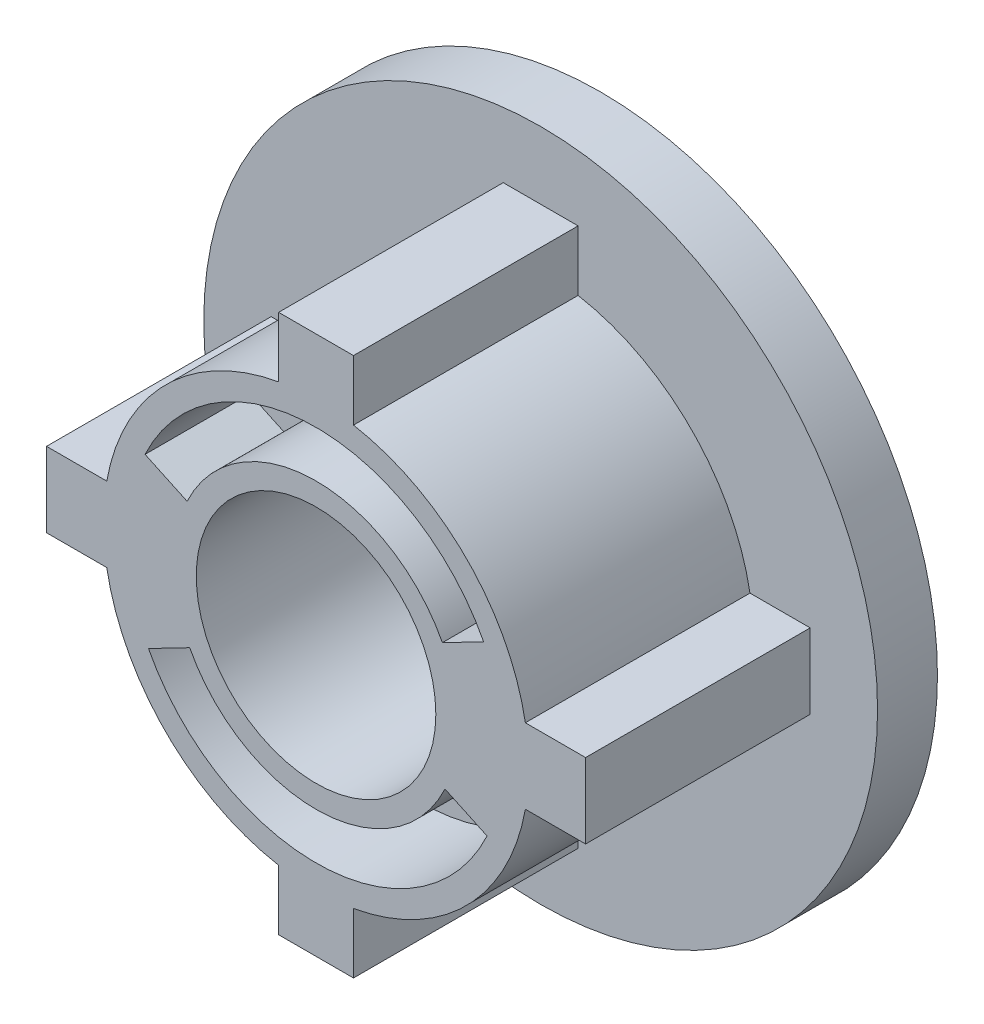
ISO-10303-21;
HEADER;
FILE_DESCRIPTION(('STEP AP214'),'2;1');
FILE_NAME('part.step','',(''),(''),'','','');
FILE_SCHEMA(('AUTOMOTIVE_DESIGN { 1 0 10303 214 1 1 1 1 }'));
ENDSEC;
DATA;
#1=APPLICATION_CONTEXT('core data for automotive mechanical design processes');
#2=APPLICATION_PROTOCOL_DEFINITION('international standard','automotive_design',2000,#1);
#3=PRODUCT_CONTEXT('',#1,'mechanical');
#4=PRODUCT('Part','Part','',(#3));
#5=PRODUCT_RELATED_PRODUCT_CATEGORY('part','',(#4));
#6=PRODUCT_DEFINITION_FORMATION('','',#4);
#7=PRODUCT_DEFINITION_CONTEXT('part definition',#1,'design');
#8=PRODUCT_DEFINITION('design','',#6,#7);
#9=PRODUCT_DEFINITION_SHAPE('','',#8);
#10=(LENGTH_UNIT() NAMED_UNIT(*) SI_UNIT(.MILLI.,.METRE.));
#11=(NAMED_UNIT(*) PLANE_ANGLE_UNIT() SI_UNIT($,.RADIAN.));
#12=(NAMED_UNIT(*) SI_UNIT($,.STERADIAN.) SOLID_ANGLE_UNIT());
#13=UNCERTAINTY_MEASURE_WITH_UNIT(LENGTH_MEASURE(1.E-05),#10,'distance_accuracy_value','');
#14=(GEOMETRIC_REPRESENTATION_CONTEXT(3) GLOBAL_UNCERTAINTY_ASSIGNED_CONTEXT((#13)) GLOBAL_UNIT_ASSIGNED_CONTEXT((#10,
#11,#12)) REPRESENTATION_CONTEXT('',''));
#15=CARTESIAN_POINT('',(0.,0.,0.));
#16=DIRECTION('',(0.,0.,1.));
#17=DIRECTION('',(1.,0.,0.));
#18=AXIS2_PLACEMENT_3D('',#15,#16,#17);
#19=CARTESIAN_POINT('',(0.,0.,0.));
#20=DIRECTION('',(0.,0.,-1.));
#21=DIRECTION('',(-1.,0.,0.));
#22=AXIS2_PLACEMENT_3D('',#19,#20,#21);
#23=PLANE('',#22);
#24=CARTESIAN_POINT('',(0.,0.,0.));
#25=DIRECTION('',(0.,0.,-1.));
#26=DIRECTION('',(-1.,0.,0.));
#27=AXIS2_PLACEMENT_3D('',#24,#25,#26);
#28=CIRCLE('',#27,22.5);
#29=CARTESIAN_POINT('',(-22.5,0.,0.));
#30=VERTEX_POINT('',#29);
#31=EDGE_CURVE('E414',#30,#30,#28,.T.);
#32=ORIENTED_EDGE('',*,*,#31,.F.);
#33=EDGE_LOOP('',(#32));
#34=FACE_BOUND('',#33,.T.);
#35=DIRECTION('',(0.,-1.,0.));
#36=VECTOR('',#35,1.);
#37=CARTESIAN_POINT('',(-2.50000000000001,0.,0.));
#38=LINE('',#37,#36);
#39=CARTESIAN_POINT('',(-2.50000000000001,18.,0.));
#40=VERTEX_POINT('',#39);
#41=CARTESIAN_POINT('',(-2.50000000000001,13.9781973086661,0.));
#42=VERTEX_POINT('',#41);
#43=EDGE_CURVE('E282',#40,#42,#38,.T.);
#44=ORIENTED_EDGE('',*,*,#43,.F.);
#45=DIRECTION('',(-1.,0.,0.));
#46=VECTOR('',#45,1.);
#47=CARTESIAN_POINT('',(0.,18.,0.));
#48=LINE('',#47,#46);
#49=CARTESIAN_POINT('',(2.5,18.,0.));
#50=VERTEX_POINT('',#49);
#51=EDGE_CURVE('E287',#50,#40,#48,.T.);
#52=ORIENTED_EDGE('',*,*,#51,.F.);
#53=DIRECTION('',(0.,1.,0.));
#54=VECTOR('',#53,1.);
#55=CARTESIAN_POINT('',(2.5,0.,0.));
#56=LINE('',#55,#54);
#57=CARTESIAN_POINT('',(2.5,13.9781973086661,0.));
#58=VERTEX_POINT('',#57);
#59=EDGE_CURVE('E359',#58,#50,#56,.T.);
#60=ORIENTED_EDGE('',*,*,#59,.F.);
#61=CARTESIAN_POINT('',(0.,0.,0.));
#62=DIRECTION('',(0.,0.,1.));
#63=DIRECTION('',(1.,0.,0.));
#64=AXIS2_PLACEMENT_3D('',#61,#62,#63);
#65=CIRCLE('',#64,14.2);
#66=CARTESIAN_POINT('',(13.9781973086661,2.5,0.));
#67=VERTEX_POINT('',#66);
#68=EDGE_CURVE('E356',#67,#58,#65,.T.);
#69=ORIENTED_EDGE('',*,*,#68,.F.);
#70=DIRECTION('',(-1.,0.,0.));
#71=VECTOR('',#70,1.);
#72=CARTESIAN_POINT('',(0.,2.5,0.));
#73=LINE('',#72,#71);
#74=CARTESIAN_POINT('',(18.,2.5,0.));
#75=VERTEX_POINT('',#74);
#76=EDGE_CURVE('E353',#75,#67,#73,.T.);
#77=ORIENTED_EDGE('',*,*,#76,.F.);
#78=DIRECTION('',(0.,1.,0.));
#79=VECTOR('',#78,1.);
#80=CARTESIAN_POINT('',(18.,0.,0.));
#81=LINE('',#80,#79);
#82=CARTESIAN_POINT('',(18.,-2.49999999999995,0.));
#83=VERTEX_POINT('',#82);
#84=EDGE_CURVE('E350',#83,#75,#81,.T.);
#85=ORIENTED_EDGE('',*,*,#84,.F.);
#86=DIRECTION('',(1.,0.,0.));
#87=VECTOR('',#86,1.);
#88=CARTESIAN_POINT('',(0.,-2.49999999999995,0.));
#89=LINE('',#88,#87);
#90=CARTESIAN_POINT('',(13.9781973086661,-2.49999999999995,0.));
#91=VERTEX_POINT('',#90);
#92=EDGE_CURVE('E347',#91,#83,#89,.T.);
#93=ORIENTED_EDGE('',*,*,#92,.F.);
#94=CARTESIAN_POINT('',(0.,0.,0.));
#95=DIRECTION('',(0.,0.,1.));
#96=DIRECTION('',(1.,0.,0.));
#97=AXIS2_PLACEMENT_3D('',#94,#95,#96);
#98=CIRCLE('',#97,14.2);
#99=CARTESIAN_POINT('',(2.5,-13.9781973086661,0.));
#100=VERTEX_POINT('',#99);
#101=EDGE_CURVE('E344',#100,#91,#98,.T.);
#102=ORIENTED_EDGE('',*,*,#101,.F.);
#103=DIRECTION('',(0.,1.,0.));
#104=VECTOR('',#103,1.);
#105=CARTESIAN_POINT('',(2.5,0.,0.));
#106=LINE('',#105,#104);
#107=CARTESIAN_POINT('',(2.5,-18.,0.));
#108=VERTEX_POINT('',#107);
#109=EDGE_CURVE('E341',#108,#100,#106,.T.);
#110=ORIENTED_EDGE('',*,*,#109,.F.);
#111=DIRECTION('',(1.,0.,0.));
#112=VECTOR('',#111,1.);
#113=CARTESIAN_POINT('',(0.,-18.,0.));
#114=LINE('',#113,#112);
#115=CARTESIAN_POINT('',(-2.5,-18.,0.));
#116=VERTEX_POINT('',#115);
#117=EDGE_CURVE('E338',#116,#108,#114,.T.);
#118=ORIENTED_EDGE('',*,*,#117,.F.);
#119=DIRECTION('',(0.,-1.,0.));
#120=VECTOR('',#119,1.);
#121=CARTESIAN_POINT('',(-2.5,0.,0.));
#122=LINE('',#121,#120);
#123=CARTESIAN_POINT('',(-2.5,-13.9781973086661,0.));
#124=VERTEX_POINT('',#123);
#125=EDGE_CURVE('E335',#124,#116,#122,.T.);
#126=ORIENTED_EDGE('',*,*,#125,.F.);
#127=CARTESIAN_POINT('',(0.,0.,0.));
#128=DIRECTION('',(0.,0.,1.));
#129=DIRECTION('',(1.,0.,0.));
#130=AXIS2_PLACEMENT_3D('',#127,#128,#129);
#131=CIRCLE('',#130,14.2);
#132=CARTESIAN_POINT('',(-13.9781973086661,-2.5,0.));
#133=VERTEX_POINT('',#132);
#134=EDGE_CURVE('E332',#133,#124,#131,.T.);
#135=ORIENTED_EDGE('',*,*,#134,.F.);
#136=DIRECTION('',(1.,0.,0.));
#137=VECTOR('',#136,1.);
#138=CARTESIAN_POINT('',(0.,-2.5,0.));
#139=LINE('',#138,#137);
#140=CARTESIAN_POINT('',(-18.,-2.5,0.));
#141=VERTEX_POINT('',#140);
#142=EDGE_CURVE('E329',#141,#133,#139,.T.);
#143=ORIENTED_EDGE('',*,*,#142,.F.);
#144=DIRECTION('',(0.,-1.,0.));
#145=VECTOR('',#144,1.);
#146=CARTESIAN_POINT('',(-18.,0.,0.));
#147=LINE('',#146,#145);
#148=CARTESIAN_POINT('',(-18.,2.49999999999995,0.));
#149=VERTEX_POINT('',#148);
#150=EDGE_CURVE('E326',#149,#141,#147,.T.);
#151=ORIENTED_EDGE('',*,*,#150,.F.);
#152=DIRECTION('',(-1.,0.,0.));
#153=VECTOR('',#152,1.);
#154=CARTESIAN_POINT('',(0.,2.49999999999995,0.));
#155=LINE('',#154,#153);
#156=CARTESIAN_POINT('',(-13.9781973086661,2.49999999999995,0.));
#157=VERTEX_POINT('',#156);
#158=EDGE_CURVE('E323',#157,#149,#155,.T.);
#159=ORIENTED_EDGE('',*,*,#158,.F.);
#160=CARTESIAN_POINT('',(0.,0.,0.));
#161=DIRECTION('',(0.,0.,1.));
#162=DIRECTION('',(1.,0.,0.));
#163=AXIS2_PLACEMENT_3D('',#160,#161,#162);
#164=CIRCLE('',#163,14.2);
#165=EDGE_CURVE('E320',#42,#157,#164,.T.);
#166=ORIENTED_EDGE('',*,*,#165,.F.);
#167=EDGE_LOOP('',(#44,#52,#60,#69,#77,#85,#93,#102,#110,#118,#126,#135,#143,#151,#159,#166));
#168=FACE_BOUND('',#167,.T.);
#169=ADVANCED_FACE('F47',(#34,#168),#23,.F.);
#170=CARTESIAN_POINT('',(0.,0.,-4.));
#171=DIRECTION('',(0.,0.,1.));
#172=DIRECTION('',(1.,0.,0.));
#173=AXIS2_PLACEMENT_3D('',#170,#171,#172);
#174=CYLINDRICAL_SURFACE('',#173,22.5);
#175=CARTESIAN_POINT('',(0.,0.,-4.));
#176=DIRECTION('',(0.,0.,-1.));
#177=DIRECTION('',(-1.,0.,0.));
#178=AXIS2_PLACEMENT_3D('',#175,#176,#177);
#179=CIRCLE('',#178,22.5);
#180=CARTESIAN_POINT('',(-22.5,0.,-4.));
#181=VERTEX_POINT('',#180);
#182=EDGE_CURVE('E55',#181,#181,#179,.T.);
#183=ORIENTED_EDGE('',*,*,#182,.F.);
#184=EDGE_LOOP('',(#183));
#185=FACE_BOUND('',#184,.T.);
#186=ORIENTED_EDGE('',*,*,#31,.T.);
#187=EDGE_LOOP('',(#186));
#188=FACE_BOUND('',#187,.T.);
#189=ADVANCED_FACE('F49',(#185,#188),#174,.T.);
#190=CARTESIAN_POINT('',(0.,0.,-4.));
#191=DIRECTION('',(0.,0.,-1.));
#192=DIRECTION('',(-1.,0.,0.));
#193=AXIS2_PLACEMENT_3D('',#190,#191,#192);
#194=PLANE('',#193);
#195=ORIENTED_EDGE('',*,*,#182,.T.);
#196=EDGE_LOOP('',(#195));
#197=FACE_BOUND('',#196,.T.);
#198=CARTESIAN_POINT('',(0.,0.,-4.));
#199=DIRECTION('',(0.,0.,-1.));
#200=DIRECTION('',(-1.,0.,0.));
#201=AXIS2_PLACEMENT_3D('',#198,#199,#200);
#202=CIRCLE('',#201,11.15);
#203=CARTESIAN_POINT('',(-11.15,0.,-4.));
#204=VERTEX_POINT('',#203);
#205=EDGE_CURVE('E411',#204,#204,#202,.T.);
#206=ORIENTED_EDGE('',*,*,#205,.F.);
#207=EDGE_LOOP('',(#206));
#208=FACE_BOUND('',#207,.T.);
#209=ADVANCED_FACE('F501',(#197,#208),#194,.T.);
#210=CARTESIAN_POINT('',(0.,0.,-44.1636651713959));
#211=DIRECTION('',(0.,0.,1.));
#212=DIRECTION('',(1.,0.,0.));
#213=AXIS2_PLACEMENT_3D('',#210,#211,#212);
#214=CYLINDRICAL_SURFACE('',#213,11.15);
#215=CARTESIAN_POINT('',(0.,0.,3.));
#216=DIRECTION('',(0.,0.,-1.));
#217=DIRECTION('',(-1.,0.,0.));
#218=AXIS2_PLACEMENT_3D('',#215,#216,#217);
#219=CIRCLE('',#218,11.15);
#220=CARTESIAN_POINT('',(-11.15,0.,3.));
#221=VERTEX_POINT('',#220);
#222=EDGE_CURVE('E11',#221,#221,#219,.T.);
#223=ORIENTED_EDGE('',*,*,#222,.F.);
#224=EDGE_LOOP('',(#223));
#225=FACE_BOUND('',#224,.T.);
#226=ORIENTED_EDGE('',*,*,#205,.T.);
#227=EDGE_LOOP('',(#226));
#228=FACE_BOUND('',#227,.T.);
#229=ADVANCED_FACE('F495',(#225,#228),#214,.F.);
#230=CARTESIAN_POINT('',(-2.50000000000001,0.,15.));
#231=DIRECTION('',(1.,0.,0.));
#232=DIRECTION('',(0.,0.,-1.));
#233=AXIS2_PLACEMENT_3D('',#230,#231,#232);
#234=PLANE('',#233);
#235=ORIENTED_EDGE('',*,*,#43,.T.);
#236=DIRECTION('',(0.,0.,-1.));
#237=VECTOR('',#236,1.);
#238=CARTESIAN_POINT('',(-2.50000000000001,13.9781973086661,15.));
#239=LINE('',#238,#237);
#240=CARTESIAN_POINT('',(-2.50000000000001,13.9781973086661,15.));
#241=VERTEX_POINT('',#240);
#242=EDGE_CURVE('E408',#241,#42,#239,.T.);
#243=ORIENTED_EDGE('',*,*,#242,.F.);
#244=DIRECTION('',(0.,-1.,0.));
#245=VECTOR('',#244,1.);
#246=CARTESIAN_POINT('',(-2.50000000000001,0.,15.));
#247=LINE('',#246,#245);
#248=CARTESIAN_POINT('',(-2.50000000000001,18.,15.));
#249=VERTEX_POINT('',#248);
#250=EDGE_CURVE('E283',#249,#241,#247,.T.);
#251=ORIENTED_EDGE('',*,*,#250,.F.);
#252=DIRECTION('',(0.,0.,-1.));
#253=VECTOR('',#252,1.);
#254=CARTESIAN_POINT('',(-2.50000000000001,18.,15.));
#255=LINE('',#254,#253);
#256=EDGE_CURVE('E317',#249,#40,#255,.T.);
#257=ORIENTED_EDGE('',*,*,#256,.T.);
#258=EDGE_LOOP('',(#235,#243,#251,#257));
#259=FACE_BOUND('',#258,.T.);
#260=ADVANCED_FACE('F430',(#259),#234,.F.);
#261=CARTESIAN_POINT('',(0.,0.,15.));
#262=DIRECTION('',(0.,0.,-1.));
#263=DIRECTION('',(-1.,0.,0.));
#264=AXIS2_PLACEMENT_3D('',#261,#262,#263);
#265=CYLINDRICAL_SURFACE('',#264,14.2);
#266=ORIENTED_EDGE('',*,*,#165,.T.);
#267=DIRECTION('',(0.,0.,-1.));
#268=VECTOR('',#267,1.);
#269=CARTESIAN_POINT('',(-13.9781973086661,2.49999999999995,15.));
#270=LINE('',#269,#268);
#271=CARTESIAN_POINT('',(-13.9781973086661,2.49999999999995,15.));
#272=VERTEX_POINT('',#271);
#273=EDGE_CURVE('E405',#272,#157,#270,.T.);
#274=ORIENTED_EDGE('',*,*,#273,.F.);
#275=CARTESIAN_POINT('',(0.,0.,15.));
#276=DIRECTION('',(0.,0.,1.));
#277=DIRECTION('',(1.,0.,0.));
#278=AXIS2_PLACEMENT_3D('',#275,#276,#277);
#279=CIRCLE('',#278,14.2);
#280=EDGE_CURVE('E286',#241,#272,#279,.T.);
#281=ORIENTED_EDGE('',*,*,#280,.F.);
#282=ORIENTED_EDGE('',*,*,#242,.T.);
#283=EDGE_LOOP('',(#266,#274,#281,#282));
#284=FACE_BOUND('',#283,.T.);
#285=ADVANCED_FACE('F487',(#284),#265,.T.);
#286=CARTESIAN_POINT('',(0.,2.49999999999995,15.));
#287=DIRECTION('',(0.,-1.,0.));
#288=DIRECTION('',(0.,0.,-1.));
#289=AXIS2_PLACEMENT_3D('',#286,#287,#288);
#290=PLANE('',#289);
#291=ORIENTED_EDGE('',*,*,#158,.T.);
#292=DIRECTION('',(0.,0.,-1.));
#293=VECTOR('',#292,1.);
#294=CARTESIAN_POINT('',(-18.,2.49999999999995,15.));
#295=LINE('',#294,#293);
#296=CARTESIAN_POINT('',(-18.,2.49999999999995,15.));
#297=VERTEX_POINT('',#296);
#298=EDGE_CURVE('E402',#297,#149,#295,.T.);
#299=ORIENTED_EDGE('',*,*,#298,.F.);
#300=DIRECTION('',(-1.,0.,0.));
#301=VECTOR('',#300,1.);
#302=CARTESIAN_POINT('',(0.,2.49999999999995,15.));
#303=LINE('',#302,#301);
#304=EDGE_CURVE('E289',#272,#297,#303,.T.);
#305=ORIENTED_EDGE('',*,*,#304,.F.);
#306=ORIENTED_EDGE('',*,*,#273,.T.);
#307=EDGE_LOOP('',(#291,#299,#305,#306));
#308=FACE_BOUND('',#307,.T.);
#309=ADVANCED_FACE('F485',(#308),#290,.F.);
#310=CARTESIAN_POINT('',(-18.,0.,15.));
#311=DIRECTION('',(1.,0.,0.));
#312=DIRECTION('',(0.,0.,-1.));
#313=AXIS2_PLACEMENT_3D('',#310,#311,#312);
#314=PLANE('',#313);
#315=ORIENTED_EDGE('',*,*,#150,.T.);
#316=DIRECTION('',(0.,0.,-1.));
#317=VECTOR('',#316,1.);
#318=CARTESIAN_POINT('',(-18.,-2.5,15.));
#319=LINE('',#318,#317);
#320=CARTESIAN_POINT('',(-18.,-2.5,15.));
#321=VERTEX_POINT('',#320);
#322=EDGE_CURVE('E399',#321,#141,#319,.T.);
#323=ORIENTED_EDGE('',*,*,#322,.F.);
#324=DIRECTION('',(0.,-1.,0.));
#325=VECTOR('',#324,1.);
#326=CARTESIAN_POINT('',(-18.,0.,15.));
#327=LINE('',#326,#325);
#328=EDGE_CURVE('E291',#297,#321,#327,.T.);
#329=ORIENTED_EDGE('',*,*,#328,.F.);
#330=ORIENTED_EDGE('',*,*,#298,.T.);
#331=EDGE_LOOP('',(#315,#323,#329,#330));
#332=FACE_BOUND('',#331,.T.);
#333=ADVANCED_FACE('F480',(#332),#314,.F.);
#334=CARTESIAN_POINT('',(0.,-2.5,15.));
#335=DIRECTION('',(0.,1.,0.));
#336=DIRECTION('',(0.,0.,1.));
#337=AXIS2_PLACEMENT_3D('',#334,#335,#336);
#338=PLANE('',#337);
#339=ORIENTED_EDGE('',*,*,#142,.T.);
#340=DIRECTION('',(0.,0.,-1.));
#341=VECTOR('',#340,1.);
#342=CARTESIAN_POINT('',(-13.9781973086661,-2.5,15.));
#343=LINE('',#342,#341);
#344=CARTESIAN_POINT('',(-13.9781973086661,-2.5,15.));
#345=VERTEX_POINT('',#344);
#346=EDGE_CURVE('E396',#345,#133,#343,.T.);
#347=ORIENTED_EDGE('',*,*,#346,.F.);
#348=DIRECTION('',(1.,0.,0.));
#349=VECTOR('',#348,1.);
#350=CARTESIAN_POINT('',(0.,-2.5,15.));
#351=LINE('',#350,#349);
#352=EDGE_CURVE('E293',#321,#345,#351,.T.);
#353=ORIENTED_EDGE('',*,*,#352,.F.);
#354=ORIENTED_EDGE('',*,*,#322,.T.);
#355=EDGE_LOOP('',(#339,#347,#353,#354));
#356=FACE_BOUND('',#355,.T.);
#357=ADVANCED_FACE('F477',(#356),#338,.F.);
#358=CARTESIAN_POINT('',(0.,0.,15.));
#359=DIRECTION('',(0.,0.,-1.));
#360=DIRECTION('',(-1.,0.,0.));
#361=AXIS2_PLACEMENT_3D('',#358,#359,#360);
#362=CYLINDRICAL_SURFACE('',#361,14.2);
#363=ORIENTED_EDGE('',*,*,#134,.T.);
#364=DIRECTION('',(0.,0.,-1.));
#365=VECTOR('',#364,1.);
#366=CARTESIAN_POINT('',(-2.5,-13.9781973086661,15.));
#367=LINE('',#366,#365);
#368=CARTESIAN_POINT('',(-2.5,-13.9781973086661,15.));
#369=VERTEX_POINT('',#368);
#370=EDGE_CURVE('E393',#369,#124,#367,.T.);
#371=ORIENTED_EDGE('',*,*,#370,.F.);
#372=CARTESIAN_POINT('',(0.,0.,15.));
#373=DIRECTION('',(0.,0.,1.));
#374=DIRECTION('',(1.,0.,0.));
#375=AXIS2_PLACEMENT_3D('',#372,#373,#374);
#376=CIRCLE('',#375,14.2);
#377=EDGE_CURVE('E295',#345,#369,#376,.T.);
#378=ORIENTED_EDGE('',*,*,#377,.F.);
#379=ORIENTED_EDGE('',*,*,#346,.T.);
#380=EDGE_LOOP('',(#363,#371,#378,#379));
#381=FACE_BOUND('',#380,.T.);
#382=ADVANCED_FACE('F472',(#381),#362,.T.);
#383=CARTESIAN_POINT('',(-2.5,0.,15.));
#384=DIRECTION('',(1.,0.,0.));
#385=DIRECTION('',(0.,0.,-1.));
#386=AXIS2_PLACEMENT_3D('',#383,#384,#385);
#387=PLANE('',#386);
#388=ORIENTED_EDGE('',*,*,#125,.T.);
#389=DIRECTION('',(0.,0.,-1.));
#390=VECTOR('',#389,1.);
#391=CARTESIAN_POINT('',(-2.5,-18.,15.));
#392=LINE('',#391,#390);
#393=CARTESIAN_POINT('',(-2.5,-18.,15.));
#394=VERTEX_POINT('',#393);
#395=EDGE_CURVE('E390',#394,#116,#392,.T.);
#396=ORIENTED_EDGE('',*,*,#395,.F.);
#397=DIRECTION('',(0.,-1.,0.));
#398=VECTOR('',#397,1.);
#399=CARTESIAN_POINT('',(-2.5,0.,15.));
#400=LINE('',#399,#398);
#401=EDGE_CURVE('E297',#369,#394,#400,.T.);
#402=ORIENTED_EDGE('',*,*,#401,.F.);
#403=ORIENTED_EDGE('',*,*,#370,.T.);
#404=EDGE_LOOP('',(#388,#396,#402,#403));
#405=FACE_BOUND('',#404,.T.);
#406=ADVANCED_FACE('F469',(#405),#387,.F.);
#407=CARTESIAN_POINT('',(0.,-18.,15.));
#408=DIRECTION('',(0.,1.,0.));
#409=DIRECTION('',(0.,0.,1.));
#410=AXIS2_PLACEMENT_3D('',#407,#408,#409);
#411=PLANE('',#410);
#412=ORIENTED_EDGE('',*,*,#117,.T.);
#413=DIRECTION('',(0.,0.,-1.));
#414=VECTOR('',#413,1.);
#415=CARTESIAN_POINT('',(2.5,-18.,15.));
#416=LINE('',#415,#414);
#417=CARTESIAN_POINT('',(2.5,-18.,15.));
#418=VERTEX_POINT('',#417);
#419=EDGE_CURVE('E387',#418,#108,#416,.T.);
#420=ORIENTED_EDGE('',*,*,#419,.F.);
#421=DIRECTION('',(1.,0.,0.));
#422=VECTOR('',#421,1.);
#423=CARTESIAN_POINT('',(0.,-18.,15.));
#424=LINE('',#423,#422);
#425=EDGE_CURVE('E299',#394,#418,#424,.T.);
#426=ORIENTED_EDGE('',*,*,#425,.F.);
#427=ORIENTED_EDGE('',*,*,#395,.T.);
#428=EDGE_LOOP('',(#412,#420,#426,#427));
#429=FACE_BOUND('',#428,.T.);
#430=ADVANCED_FACE('F464',(#429),#411,.F.);
#431=CARTESIAN_POINT('',(2.5,0.,15.));
#432=DIRECTION('',(-1.,0.,0.));
#433=DIRECTION('',(0.,0.,1.));
#434=AXIS2_PLACEMENT_3D('',#431,#432,#433);
#435=PLANE('',#434);
#436=ORIENTED_EDGE('',*,*,#109,.T.);
#437=DIRECTION('',(0.,0.,-1.));
#438=VECTOR('',#437,1.);
#439=CARTESIAN_POINT('',(2.5,-13.9781973086661,15.));
#440=LINE('',#439,#438);
#441=CARTESIAN_POINT('',(2.5,-13.9781973086661,15.));
#442=VERTEX_POINT('',#441);
#443=EDGE_CURVE('E384',#442,#100,#440,.T.);
#444=ORIENTED_EDGE('',*,*,#443,.F.);
#445=DIRECTION('',(0.,1.,0.));
#446=VECTOR('',#445,1.);
#447=CARTESIAN_POINT('',(2.5,0.,15.));
#448=LINE('',#447,#446);
#449=EDGE_CURVE('E301',#418,#442,#448,.T.);
#450=ORIENTED_EDGE('',*,*,#449,.F.);
#451=ORIENTED_EDGE('',*,*,#419,.T.);
#452=EDGE_LOOP('',(#436,#444,#450,#451));
#453=FACE_BOUND('',#452,.T.);
#454=ADVANCED_FACE('F461',(#453),#435,.F.);
#455=CARTESIAN_POINT('',(0.,0.,15.));
#456=DIRECTION('',(0.,0.,-1.));
#457=DIRECTION('',(-1.,0.,0.));
#458=AXIS2_PLACEMENT_3D('',#455,#456,#457);
#459=CYLINDRICAL_SURFACE('',#458,14.2);
#460=ORIENTED_EDGE('',*,*,#101,.T.);
#461=DIRECTION('',(0.,0.,-1.));
#462=VECTOR('',#461,1.);
#463=CARTESIAN_POINT('',(13.9781973086661,-2.49999999999995,15.));
#464=LINE('',#463,#462);
#465=CARTESIAN_POINT('',(13.9781973086661,-2.49999999999995,15.));
#466=VERTEX_POINT('',#465);
#467=EDGE_CURVE('E381',#466,#91,#464,.T.);
#468=ORIENTED_EDGE('',*,*,#467,.F.);
#469=CARTESIAN_POINT('',(0.,0.,15.));
#470=DIRECTION('',(0.,0.,1.));
#471=DIRECTION('',(1.,0.,0.));
#472=AXIS2_PLACEMENT_3D('',#469,#470,#471);
#473=CIRCLE('',#472,14.2);
#474=EDGE_CURVE('E303',#442,#466,#473,.T.);
#475=ORIENTED_EDGE('',*,*,#474,.F.);
#476=ORIENTED_EDGE('',*,*,#443,.T.);
#477=EDGE_LOOP('',(#460,#468,#475,#476));
#478=FACE_BOUND('',#477,.T.);
#479=ADVANCED_FACE('F456',(#478),#459,.T.);
#480=CARTESIAN_POINT('',(0.,-2.49999999999995,15.));
#481=DIRECTION('',(0.,1.,0.));
#482=DIRECTION('',(0.,0.,1.));
#483=AXIS2_PLACEMENT_3D('',#480,#481,#482);
#484=PLANE('',#483);
#485=ORIENTED_EDGE('',*,*,#92,.T.);
#486=DIRECTION('',(0.,0.,-1.));
#487=VECTOR('',#486,1.);
#488=CARTESIAN_POINT('',(18.,-2.49999999999995,15.));
#489=LINE('',#488,#487);
#490=CARTESIAN_POINT('',(18.,-2.49999999999995,15.));
#491=VERTEX_POINT('',#490);
#492=EDGE_CURVE('E378',#491,#83,#489,.T.);
#493=ORIENTED_EDGE('',*,*,#492,.F.);
#494=DIRECTION('',(1.,0.,0.));
#495=VECTOR('',#494,1.);
#496=CARTESIAN_POINT('',(0.,-2.49999999999995,15.));
#497=LINE('',#496,#495);
#498=EDGE_CURVE('E305',#466,#491,#497,.T.);
#499=ORIENTED_EDGE('',*,*,#498,.F.);
#500=ORIENTED_EDGE('',*,*,#467,.T.);
#501=EDGE_LOOP('',(#485,#493,#499,#500));
#502=FACE_BOUND('',#501,.T.);
#503=ADVANCED_FACE('F453',(#502),#484,.F.);
#504=CARTESIAN_POINT('',(18.,0.,15.));
#505=DIRECTION('',(-1.,0.,0.));
#506=DIRECTION('',(0.,0.,1.));
#507=AXIS2_PLACEMENT_3D('',#504,#505,#506);
#508=PLANE('',#507);
#509=ORIENTED_EDGE('',*,*,#84,.T.);
#510=DIRECTION('',(0.,0.,-1.));
#511=VECTOR('',#510,1.);
#512=CARTESIAN_POINT('',(18.,2.5,15.));
#513=LINE('',#512,#511);
#514=CARTESIAN_POINT('',(18.,2.5,15.));
#515=VERTEX_POINT('',#514);
#516=EDGE_CURVE('E375',#515,#75,#513,.T.);
#517=ORIENTED_EDGE('',*,*,#516,.F.);
#518=DIRECTION('',(0.,1.,0.));
#519=VECTOR('',#518,1.);
#520=CARTESIAN_POINT('',(18.,0.,15.));
#521=LINE('',#520,#519);
#522=EDGE_CURVE('E307',#491,#515,#521,.T.);
#523=ORIENTED_EDGE('',*,*,#522,.F.);
#524=ORIENTED_EDGE('',*,*,#492,.T.);
#525=EDGE_LOOP('',(#509,#517,#523,#524));
#526=FACE_BOUND('',#525,.T.);
#527=ADVANCED_FACE('F448',(#526),#508,.F.);
#528=CARTESIAN_POINT('',(0.,2.5,15.));
#529=DIRECTION('',(0.,-1.,0.));
#530=DIRECTION('',(0.,0.,-1.));
#531=AXIS2_PLACEMENT_3D('',#528,#529,#530);
#532=PLANE('',#531);
#533=ORIENTED_EDGE('',*,*,#76,.T.);
#534=DIRECTION('',(0.,0.,-1.));
#535=VECTOR('',#534,1.);
#536=CARTESIAN_POINT('',(13.9781973086661,2.5,15.));
#537=LINE('',#536,#535);
#538=CARTESIAN_POINT('',(13.9781973086661,2.5,15.));
#539=VERTEX_POINT('',#538);
#540=EDGE_CURVE('E372',#539,#67,#537,.T.);
#541=ORIENTED_EDGE('',*,*,#540,.F.);
#542=DIRECTION('',(-1.,0.,0.));
#543=VECTOR('',#542,1.);
#544=CARTESIAN_POINT('',(0.,2.5,15.));
#545=LINE('',#544,#543);
#546=EDGE_CURVE('E309',#515,#539,#545,.T.);
#547=ORIENTED_EDGE('',*,*,#546,.F.);
#548=ORIENTED_EDGE('',*,*,#516,.T.);
#549=EDGE_LOOP('',(#533,#541,#547,#548));
#550=FACE_BOUND('',#549,.T.);
#551=ADVANCED_FACE('F445',(#550),#532,.F.);
#552=CARTESIAN_POINT('',(0.,0.,15.));
#553=DIRECTION('',(0.,0.,-1.));
#554=DIRECTION('',(-1.,0.,0.));
#555=AXIS2_PLACEMENT_3D('',#552,#553,#554);
#556=CYLINDRICAL_SURFACE('',#555,14.2);
#557=ORIENTED_EDGE('',*,*,#68,.T.);
#558=DIRECTION('',(0.,0.,-1.));
#559=VECTOR('',#558,1.);
#560=CARTESIAN_POINT('',(2.5,13.9781973086661,15.));
#561=LINE('',#560,#559);
#562=CARTESIAN_POINT('',(2.5,13.9781973086661,15.));
#563=VERTEX_POINT('',#562);
#564=EDGE_CURVE('E369',#563,#58,#561,.T.);
#565=ORIENTED_EDGE('',*,*,#564,.F.);
#566=CARTESIAN_POINT('',(0.,0.,15.));
#567=DIRECTION('',(0.,0.,1.));
#568=DIRECTION('',(1.,0.,0.));
#569=AXIS2_PLACEMENT_3D('',#566,#567,#568);
#570=CIRCLE('',#569,14.2);
#571=EDGE_CURVE('E311',#539,#563,#570,.T.);
#572=ORIENTED_EDGE('',*,*,#571,.F.);
#573=ORIENTED_EDGE('',*,*,#540,.T.);
#574=EDGE_LOOP('',(#557,#565,#572,#573));
#575=FACE_BOUND('',#574,.T.);
#576=ADVANCED_FACE('F441',(#575),#556,.T.);
#577=CARTESIAN_POINT('',(2.5,0.,15.));
#578=DIRECTION('',(-1.,0.,0.));
#579=DIRECTION('',(0.,0.,1.));
#580=AXIS2_PLACEMENT_3D('',#577,#578,#579);
#581=PLANE('',#580);
#582=ORIENTED_EDGE('',*,*,#59,.T.);
#583=DIRECTION('',(0.,0.,-1.));
#584=VECTOR('',#583,1.);
#585=CARTESIAN_POINT('',(2.5,18.,15.));
#586=LINE('',#585,#584);
#587=CARTESIAN_POINT('',(2.5,18.,15.));
#588=VERTEX_POINT('',#587);
#589=EDGE_CURVE('E366',#588,#50,#586,.T.);
#590=ORIENTED_EDGE('',*,*,#589,.F.);
#591=DIRECTION('',(0.,1.,0.));
#592=VECTOR('',#591,1.);
#593=CARTESIAN_POINT('',(2.5,0.,15.));
#594=LINE('',#593,#592);
#595=EDGE_CURVE('E313',#563,#588,#594,.T.);
#596=ORIENTED_EDGE('',*,*,#595,.F.);
#597=ORIENTED_EDGE('',*,*,#564,.T.);
#598=EDGE_LOOP('',(#582,#590,#596,#597));
#599=FACE_BOUND('',#598,.T.);
#600=ADVANCED_FACE('F439',(#599),#581,.F.);
#601=CARTESIAN_POINT('',(0.,18.,15.));
#602=DIRECTION('',(0.,-1.,0.));
#603=DIRECTION('',(0.,0.,-1.));
#604=AXIS2_PLACEMENT_3D('',#601,#602,#603);
#605=PLANE('',#604);
#606=ORIENTED_EDGE('',*,*,#51,.T.);
#607=ORIENTED_EDGE('',*,*,#256,.F.);
#608=DIRECTION('',(-1.,0.,0.));
#609=VECTOR('',#608,1.);
#610=CARTESIAN_POINT('',(0.,18.,15.));
#611=LINE('',#610,#609);
#612=EDGE_CURVE('E315',#588,#249,#611,.T.);
#613=ORIENTED_EDGE('',*,*,#612,.F.);
#614=ORIENTED_EDGE('',*,*,#589,.T.);
#615=EDGE_LOOP('',(#606,#607,#613,#614));
#616=FACE_BOUND('',#615,.T.);
#617=ADVANCED_FACE('F426',(#616),#605,.F.);
#618=CARTESIAN_POINT('',(0.,0.,15.));
#619=DIRECTION('',(0.,0.,1.));
#620=DIRECTION('',(1.,0.,0.));
#621=AXIS2_PLACEMENT_3D('',#618,#619,#620);
#622=PLANE('',#621);
#623=CARTESIAN_POINT('',(0.,0.,15.));
#624=DIRECTION('',(0.,0.,1.));
#625=DIRECTION('',(1.,0.,0.));
#626=AXIS2_PLACEMENT_3D('',#623,#624,#625);
#627=CIRCLE('',#626,12.6);
#628=CARTESIAN_POINT('',(11.1911524912568,5.78948235315015,15.));
#629=VERTEX_POINT('',#628);
#630=CARTESIAN_POINT('',(-11.4194781166618,5.32499009793283,15.));
#631=VERTEX_POINT('',#630);
#632=EDGE_CURVE('E62',#629,#631,#627,.T.);
#633=ORIENTED_EDGE('',*,*,#632,.F.);
#634=DIRECTION('',(0.888186705655301,0.459482726440488,0.));
#635=VECTOR('',#634,1.);
#636=CARTESIAN_POINT('',(8.43777370372536,4.36508590118464,15.));
#637=LINE('',#636,#635);
#638=CARTESIAN_POINT('',(8.43777370372536,4.36508590118464,15.));
#639=VERTEX_POINT('',#638);
#640=EDGE_CURVE('E228',#639,#629,#637,.T.);
#641=ORIENTED_EDGE('',*,*,#640,.F.);
#642=CARTESIAN_POINT('',(0.,0.,15.));
#643=DIRECTION('',(0.,0.,-1.));
#644=DIRECTION('',(1.,0.,0.));
#645=AXIS2_PLACEMENT_3D('',#642,#643,#644);
#646=CIRCLE('',#645,9.5);
#647=CARTESIAN_POINT('',(-8.60992397684817,4.01487348653666,15.));
#648=VERTEX_POINT('',#647);
#649=EDGE_CURVE('E231',#648,#639,#646,.T.);
#650=ORIENTED_EDGE('',*,*,#649,.F.);
#651=DIRECTION('',(0.906307787036649,-0.422618261740701,0.));
#652=VECTOR('',#651,1.);
#653=CARTESIAN_POINT('',(-11.4194781166618,5.32499009793283,15.));
#654=LINE('',#653,#652);
#655=EDGE_CURVE('E237',#631,#648,#654,.T.);
#656=ORIENTED_EDGE('',*,*,#655,.F.);
#657=EDGE_LOOP('',(#633,#641,#650,#656));
#658=FACE_BOUND('',#657,.T.);
#659=CARTESIAN_POINT('',(0.,0.,15.));
#660=DIRECTION('',(0.,0.,1.));
#661=DIRECTION('',(1.,0.,0.));
#662=AXIS2_PLACEMENT_3D('',#659,#660,#661);
#663=CIRCLE('',#662,12.6);
#664=CARTESIAN_POINT('',(-11.1911524912568,-5.78948235315015,15.));
#665=VERTEX_POINT('',#664);
#666=CARTESIAN_POINT('',(11.4194781166618,-5.32499009793283,15.));
#667=VERTEX_POINT('',#666);
#668=EDGE_CURVE('E70',#665,#667,#663,.T.);
#669=ORIENTED_EDGE('',*,*,#668,.F.);
#670=DIRECTION('',(-0.888186705655301,-0.459482726440488,0.));
#671=VECTOR('',#670,1.);
#672=CARTESIAN_POINT('',(-11.1911524912568,-5.78948235315015,15.));
#673=LINE('',#672,#671);
#674=CARTESIAN_POINT('',(-8.43777370372536,-4.36508590118463,15.));
#675=VERTEX_POINT('',#674);
#676=EDGE_CURVE('E256',#675,#665,#673,.T.);
#677=ORIENTED_EDGE('',*,*,#676,.F.);
#678=CARTESIAN_POINT('',(0.,0.,15.));
#679=DIRECTION('',(0.,0.,-1.));
#680=DIRECTION('',(1.,0.,0.));
#681=AXIS2_PLACEMENT_3D('',#678,#679,#680);
#682=CIRCLE('',#681,9.5);
#683=CARTESIAN_POINT('',(8.60992397684817,-4.01487348653666,15.));
#684=VERTEX_POINT('',#683);
#685=EDGE_CURVE('E259',#684,#675,#682,.T.);
#686=ORIENTED_EDGE('',*,*,#685,.F.);
#687=DIRECTION('',(-0.906307787036649,0.422618261740701,0.));
#688=VECTOR('',#687,1.);
#689=CARTESIAN_POINT('',(8.60992397684817,-4.01487348653666,15.));
#690=LINE('',#689,#688);
#691=EDGE_CURVE('E263',#667,#684,#690,.T.);
#692=ORIENTED_EDGE('',*,*,#691,.F.);
#693=EDGE_LOOP('',(#669,#677,#686,#692));
#694=FACE_BOUND('',#693,.T.);
#695=ORIENTED_EDGE('',*,*,#250,.T.);
#696=ORIENTED_EDGE('',*,*,#280,.T.);
#697=ORIENTED_EDGE('',*,*,#304,.T.);
#698=ORIENTED_EDGE('',*,*,#328,.T.);
#699=ORIENTED_EDGE('',*,*,#352,.T.);
#700=ORIENTED_EDGE('',*,*,#377,.T.);
#701=ORIENTED_EDGE('',*,*,#401,.T.);
#702=ORIENTED_EDGE('',*,*,#425,.T.);
#703=ORIENTED_EDGE('',*,*,#449,.T.);
#704=ORIENTED_EDGE('',*,*,#474,.T.);
#705=ORIENTED_EDGE('',*,*,#498,.T.);
#706=ORIENTED_EDGE('',*,*,#522,.T.);
#707=ORIENTED_EDGE('',*,*,#546,.T.);
#708=ORIENTED_EDGE('',*,*,#571,.T.);
#709=ORIENTED_EDGE('',*,*,#595,.T.);
#710=ORIENTED_EDGE('',*,*,#612,.T.);
#711=EDGE_LOOP('',(#695,#696,#697,#698,#699,#700,#701,#702,#703,#704,#705,#706,#707,#708,#709,#710));
#712=FACE_BOUND('',#711,.T.);
#713=CARTESIAN_POINT('',(0.,0.,15.));
#714=DIRECTION('',(0.,0.,1.));
#715=DIRECTION('',(1.,0.,0.));
#716=AXIS2_PLACEMENT_3D('',#713,#714,#715);
#717=CIRCLE('',#716,8.);
#718=CARTESIAN_POINT('',(8.,0.,15.));
#719=VERTEX_POINT('',#718);
#720=EDGE_CURVE('E279',#719,#719,#717,.T.);
#721=ORIENTED_EDGE('',*,*,#720,.F.);
#722=EDGE_LOOP('',(#721));
#723=FACE_BOUND('',#722,.T.);
#724=ADVANCED_FACE('F432',(#658,#694,#712,#723),#622,.T.);
#725=CARTESIAN_POINT('',(0.,0.,7.));
#726=DIRECTION('',(0.,0.,1.));
#727=DIRECTION('',(1.,0.,0.));
#728=AXIS2_PLACEMENT_3D('',#725,#726,#727);
#729=CYLINDRICAL_SURFACE('',#728,8.);
#730=ORIENTED_EDGE('',*,*,#720,.T.);
#731=EDGE_LOOP('',(#730));
#732=FACE_BOUND('',#731,.T.);
#733=CARTESIAN_POINT('',(0.,0.,3.));
#734=DIRECTION('',(0.,0.,-1.));
#735=DIRECTION('',(-1.,0.,0.));
#736=AXIS2_PLACEMENT_3D('',#733,#734,#735);
#737=CIRCLE('',#736,8.);
#738=CARTESIAN_POINT('',(-8.,0.,3.));
#739=VERTEX_POINT('',#738);
#740=EDGE_CURVE('E243',#739,#739,#737,.T.);
#741=ORIENTED_EDGE('',*,*,#740,.T.);
#742=EDGE_LOOP('',(#741));
#743=FACE_BOUND('',#742,.T.);
#744=ADVANCED_FACE('F550',(#732,#743),#729,.F.);
#745=CARTESIAN_POINT('',(0.,0.,3.));
#746=DIRECTION('',(0.,0.,-1.));
#747=DIRECTION('',(-1.,0.,0.));
#748=AXIS2_PLACEMENT_3D('',#745,#746,#747);
#749=PLANE('',#748);
#750=ORIENTED_EDGE('',*,*,#222,.T.);
#751=EDGE_LOOP('',(#750));
#752=FACE_BOUND('',#751,.T.);
#753=ORIENTED_EDGE('',*,*,#740,.F.);
#754=EDGE_LOOP('',(#753));
#755=FACE_BOUND('',#754,.T.);
#756=ADVANCED_FACE('F554',(#752,#755),#749,.T.);
#757=CARTESIAN_POINT('',(0.,0.,8.));
#758=DIRECTION('',(0.,0.,1.));
#759=DIRECTION('',(1.,0.,0.));
#760=AXIS2_PLACEMENT_3D('',#757,#758,#759);
#761=CYLINDRICAL_SURFACE('',#760,12.6);
#762=ORIENTED_EDGE('',*,*,#668,.T.);
#763=DIRECTION('',(0.,0.,1.));
#764=VECTOR('',#763,1.);
#765=CARTESIAN_POINT('',(11.4194781166618,-5.32499009793283,8.));
#766=LINE('',#765,#764);
#767=CARTESIAN_POINT('',(11.4194781166618,-5.32499009793283,8.));
#768=VERTEX_POINT('',#767);
#769=EDGE_CURVE('E247',#768,#667,#766,.T.);
#770=ORIENTED_EDGE('',*,*,#769,.F.);
#771=CARTESIAN_POINT('',(0.,0.,8.));
#772=DIRECTION('',(0.,0.,1.));
#773=DIRECTION('',(1.,0.,0.));
#774=AXIS2_PLACEMENT_3D('',#771,#772,#773);
#775=CIRCLE('',#774,12.6);
#776=CARTESIAN_POINT('',(-11.1911524912568,-5.78948235315015,8.));
#777=VERTEX_POINT('',#776);
#778=EDGE_CURVE('E260',#777,#768,#775,.T.);
#779=ORIENTED_EDGE('',*,*,#778,.F.);
#780=DIRECTION('',(0.,0.,1.));
#781=VECTOR('',#780,1.);
#782=CARTESIAN_POINT('',(-11.1911524912568,-5.78948235315015,8.));
#783=LINE('',#782,#781);
#784=EDGE_CURVE('E254',#777,#665,#783,.T.);
#785=ORIENTED_EDGE('',*,*,#784,.T.);
#786=EDGE_LOOP('',(#762,#770,#779,#785));
#787=FACE_BOUND('',#786,.T.);
#788=ADVANCED_FACE('F564',(#787),#761,.F.);
#789=CARTESIAN_POINT('',(-11.1911524912568,-5.78948235315015,8.));
#790=DIRECTION('',(-0.459482726440488,0.888186705655301,0.));
#791=DIRECTION('',(-0.888186705655301,-0.459482726440488,0.));
#792=AXIS2_PLACEMENT_3D('',#789,#790,#791);
#793=PLANE('',#792);
#794=ORIENTED_EDGE('',*,*,#676,.T.);
#795=ORIENTED_EDGE('',*,*,#784,.F.);
#796=DIRECTION('',(-0.888186705655301,-0.459482726440488,0.));
#797=VECTOR('',#796,1.);
#798=CARTESIAN_POINT('',(-11.1911524912568,-5.78948235315015,8.));
#799=LINE('',#798,#797);
#800=CARTESIAN_POINT('',(-8.43777370372536,-4.36508590118463,8.));
#801=VERTEX_POINT('',#800);
#802=EDGE_CURVE('E249',#801,#777,#799,.T.);
#803=ORIENTED_EDGE('',*,*,#802,.F.);
#804=DIRECTION('',(0.,0.,1.));
#805=VECTOR('',#804,1.);
#806=CARTESIAN_POINT('',(-8.43777370372536,-4.36508590118463,8.));
#807=LINE('',#806,#805);
#808=EDGE_CURVE('E252',#801,#675,#807,.T.);
#809=ORIENTED_EDGE('',*,*,#808,.T.);
#810=EDGE_LOOP('',(#794,#795,#803,#809));
#811=FACE_BOUND('',#810,.T.);
#812=ADVANCED_FACE('F575',(#811),#793,.F.);
#813=CARTESIAN_POINT('',(0.,0.,8.));
#814=DIRECTION('',(0.,0.,1.));
#815=DIRECTION('',(1.,0.,0.));
#816=AXIS2_PLACEMENT_3D('',#813,#814,#815);
#817=CYLINDRICAL_SURFACE('',#816,9.5);
#818=ORIENTED_EDGE('',*,*,#685,.T.);
#819=ORIENTED_EDGE('',*,*,#808,.F.);
#820=CARTESIAN_POINT('',(0.,0.,8.));
#821=DIRECTION('',(0.,0.,-1.));
#822=DIRECTION('',(1.,0.,0.));
#823=AXIS2_PLACEMENT_3D('',#820,#821,#822);
#824=CIRCLE('',#823,9.5);
#825=CARTESIAN_POINT('',(8.60992397684817,-4.01487348653666,8.));
#826=VERTEX_POINT('',#825);
#827=EDGE_CURVE('E269',#826,#801,#824,.T.);
#828=ORIENTED_EDGE('',*,*,#827,.F.);
#829=DIRECTION('',(0.,0.,1.));
#830=VECTOR('',#829,1.);
#831=CARTESIAN_POINT('',(8.60992397684817,-4.01487348653666,8.));
#832=LINE('',#831,#830);
#833=EDGE_CURVE('E250',#826,#684,#832,.T.);
#834=ORIENTED_EDGE('',*,*,#833,.T.);
#835=EDGE_LOOP('',(#818,#819,#828,#834));
#836=FACE_BOUND('',#835,.T.);
#837=ADVANCED_FACE('F584',(#836),#817,.T.);
#838=CARTESIAN_POINT('',(8.60992397684817,-4.01487348653666,8.));
#839=DIRECTION('',(0.422618261740701,0.906307787036649,0.));
#840=DIRECTION('',(-0.906307787036649,0.422618261740701,0.));
#841=AXIS2_PLACEMENT_3D('',#838,#839,#840);
#842=PLANE('',#841);
#843=ORIENTED_EDGE('',*,*,#691,.T.);
#844=ORIENTED_EDGE('',*,*,#833,.F.);
#845=DIRECTION('',(-0.906307787036649,0.422618261740701,0.));
#846=VECTOR('',#845,1.);
#847=CARTESIAN_POINT('',(8.60992397684817,-4.01487348653666,8.));
#848=LINE('',#847,#846);
#849=EDGE_CURVE('E272',#768,#826,#848,.T.);
#850=ORIENTED_EDGE('',*,*,#849,.F.);
#851=ORIENTED_EDGE('',*,*,#769,.T.);
#852=EDGE_LOOP('',(#843,#844,#850,#851));
#853=FACE_BOUND('',#852,.T.);
#854=ADVANCED_FACE('F594',(#853),#842,.F.);
#855=CARTESIAN_POINT('',(0.,0.,8.));
#856=DIRECTION('',(0.,0.,1.));
#857=DIRECTION('',(1.,0.,0.));
#858=AXIS2_PLACEMENT_3D('',#855,#856,#857);
#859=PLANE('',#858);
#860=ORIENTED_EDGE('',*,*,#778,.T.);
#861=ORIENTED_EDGE('',*,*,#849,.T.);
#862=ORIENTED_EDGE('',*,*,#827,.T.);
#863=ORIENTED_EDGE('',*,*,#802,.T.);
#864=EDGE_LOOP('',(#860,#861,#862,#863));
#865=FACE_BOUND('',#864,.T.);
#866=ADVANCED_FACE('F604',(#865),#859,.T.);
#867=CARTESIAN_POINT('',(0.,0.,8.));
#868=DIRECTION('',(0.,0.,1.));
#869=DIRECTION('',(1.,0.,0.));
#870=AXIS2_PLACEMENT_3D('',#867,#868,#869);
#871=CYLINDRICAL_SURFACE('',#870,12.6);
#872=ORIENTED_EDGE('',*,*,#632,.T.);
#873=DIRECTION('',(0.,0.,1.));
#874=VECTOR('',#873,1.);
#875=CARTESIAN_POINT('',(-11.4194781166618,5.32499009793283,8.));
#876=LINE('',#875,#874);
#877=CARTESIAN_POINT('',(-11.4194781166618,5.32499009793283,8.));
#878=VERTEX_POINT('',#877);
#879=EDGE_CURVE('E206',#878,#631,#876,.T.);
#880=ORIENTED_EDGE('',*,*,#879,.F.);
#881=CARTESIAN_POINT('',(0.,0.,8.));
#882=DIRECTION('',(0.,0.,1.));
#883=DIRECTION('',(1.,0.,0.));
#884=AXIS2_PLACEMENT_3D('',#881,#882,#883);
#885=CIRCLE('',#884,12.6);
#886=CARTESIAN_POINT('',(11.1911524912568,5.78948235315015,8.));
#887=VERTEX_POINT('',#886);
#888=EDGE_CURVE('E210',#887,#878,#885,.T.);
#889=ORIENTED_EDGE('',*,*,#888,.F.);
#890=DIRECTION('',(0.,0.,1.));
#891=VECTOR('',#890,1.);
#892=CARTESIAN_POINT('',(11.1911524912568,5.78948235315015,8.));
#893=LINE('',#892,#891);
#894=EDGE_CURVE('E241',#887,#629,#893,.T.);
#895=ORIENTED_EDGE('',*,*,#894,.T.);
#896=EDGE_LOOP('',(#872,#880,#889,#895));
#897=FACE_BOUND('',#896,.T.);
#898=ADVANCED_FACE('F208',(#897),#871,.F.);
#899=CARTESIAN_POINT('',(8.43777370372536,4.36508590118464,8.));
#900=DIRECTION('',(0.459482726440487,-0.888186705655301,0.));
#901=DIRECTION('',(0.888186705655301,0.459482726440487,0.));
#902=AXIS2_PLACEMENT_3D('',#899,#900,#901);
#903=PLANE('',#902);
#904=ORIENTED_EDGE('',*,*,#640,.T.);
#905=ORIENTED_EDGE('',*,*,#894,.F.);
#906=DIRECTION('',(0.888186705655301,0.459482726440488,0.));
#907=VECTOR('',#906,1.);
#908=CARTESIAN_POINT('',(8.43777370372536,4.36508590118464,8.));
#909=LINE('',#908,#907);
#910=CARTESIAN_POINT('',(8.43777370372536,4.36508590118464,8.));
#911=VERTEX_POINT('',#910);
#912=EDGE_CURVE('E216',#911,#887,#909,.T.);
#913=ORIENTED_EDGE('',*,*,#912,.F.);
#914=DIRECTION('',(0.,0.,1.));
#915=VECTOR('',#914,1.);
#916=CARTESIAN_POINT('',(8.43777370372536,4.36508590118464,8.));
#917=LINE('',#916,#915);
#918=EDGE_CURVE('E244',#911,#639,#917,.T.);
#919=ORIENTED_EDGE('',*,*,#918,.T.);
#920=EDGE_LOOP('',(#904,#905,#913,#919));
#921=FACE_BOUND('',#920,.T.);
#922=ADVANCED_FACE('F626',(#921),#903,.F.);
#923=CARTESIAN_POINT('',(0.,0.,8.));
#924=DIRECTION('',(0.,0.,1.));
#925=DIRECTION('',(1.,0.,0.));
#926=AXIS2_PLACEMENT_3D('',#923,#924,#925);
#927=CYLINDRICAL_SURFACE('',#926,9.5);
#928=ORIENTED_EDGE('',*,*,#649,.T.);
#929=ORIENTED_EDGE('',*,*,#918,.F.);
#930=CARTESIAN_POINT('',(0.,0.,8.));
#931=DIRECTION('',(0.,0.,-1.));
#932=DIRECTION('',(1.,0.,0.));
#933=AXIS2_PLACEMENT_3D('',#930,#931,#932);
#934=CIRCLE('',#933,9.5);
#935=CARTESIAN_POINT('',(-8.60992397684817,4.01487348653666,8.));
#936=VERTEX_POINT('',#935);
#937=EDGE_CURVE('E224',#936,#911,#934,.T.);
#938=ORIENTED_EDGE('',*,*,#937,.F.);
#939=DIRECTION('',(0.,0.,1.));
#940=VECTOR('',#939,1.);
#941=CARTESIAN_POINT('',(-8.60992397684817,4.01487348653666,8.));
#942=LINE('',#941,#940);
#943=EDGE_CURVE('E215',#936,#648,#942,.T.);
#944=ORIENTED_EDGE('',*,*,#943,.T.);
#945=EDGE_LOOP('',(#928,#929,#938,#944));
#946=FACE_BOUND('',#945,.T.);
#947=ADVANCED_FACE('F635',(#946),#927,.T.);
#948=CARTESIAN_POINT('',(-11.4194781166618,5.32499009793283,8.));
#949=DIRECTION('',(-0.422618261740701,-0.906307787036649,0.));
#950=DIRECTION('',(0.90630778703665,-0.422618261740701,0.));
#951=AXIS2_PLACEMENT_3D('',#948,#949,#950);
#952=PLANE('',#951);
#953=ORIENTED_EDGE('',*,*,#655,.T.);
#954=ORIENTED_EDGE('',*,*,#943,.F.);
#955=DIRECTION('',(0.906307787036649,-0.422618261740701,0.));
#956=VECTOR('',#955,1.);
#957=CARTESIAN_POINT('',(-11.4194781166618,5.32499009793283,8.));
#958=LINE('',#957,#956);
#959=EDGE_CURVE('E219',#878,#936,#958,.T.);
#960=ORIENTED_EDGE('',*,*,#959,.F.);
#961=ORIENTED_EDGE('',*,*,#879,.T.);
#962=EDGE_LOOP('',(#953,#954,#960,#961));
#963=FACE_BOUND('',#962,.T.);
#964=ADVANCED_FACE('F220',(#963),#952,.F.);
#965=CARTESIAN_POINT('',(0.,0.,8.));
#966=DIRECTION('',(0.,0.,1.));
#967=DIRECTION('',(1.,0.,0.));
#968=AXIS2_PLACEMENT_3D('',#965,#966,#967);
#969=PLANE('',#968);
#970=ORIENTED_EDGE('',*,*,#888,.T.);
#971=ORIENTED_EDGE('',*,*,#959,.T.);
#972=ORIENTED_EDGE('',*,*,#937,.T.);
#973=ORIENTED_EDGE('',*,*,#912,.T.);
#974=EDGE_LOOP('',(#970,#971,#972,#973));
#975=FACE_BOUND('',#974,.T.);
#976=ADVANCED_FACE('F226',(#975),#969,.T.);
#977=CLOSED_SHELL('',(#169,#189,#209,#229,#260,#285,#309,#333,#357,#382,#406,#430,#454,#479,
#503,#527,#551,#576,#600,#617,#724,#744,#756,#788,#812,#837,#854,#866,#898,#922,#947,#964,#976));
#978=MANIFOLD_SOLID_BREP('B2',#977);
#979=ADVANCED_BREP_SHAPE_REPRESENTATION('',(#18,#978),#14);
#980=SHAPE_DEFINITION_REPRESENTATION(#9,#979);
ENDSEC;
END-ISO-10303-21;
